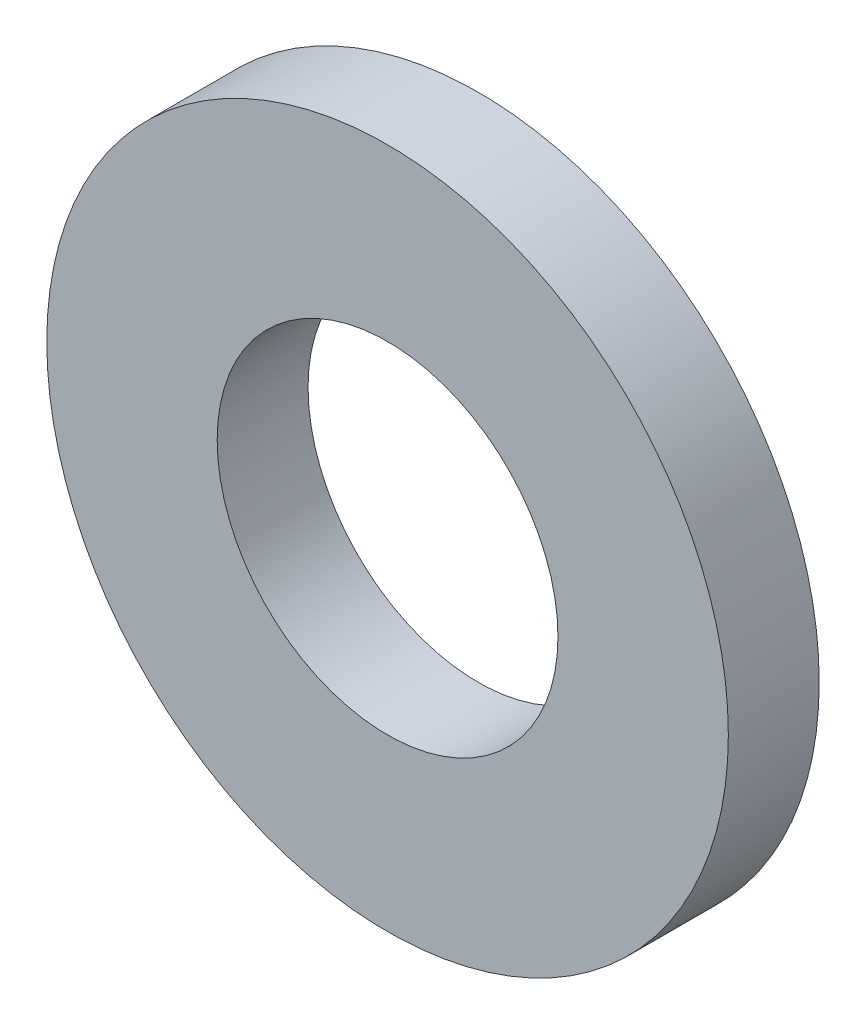
ISO-10303-21;
HEADER;
FILE_DESCRIPTION(('STEP AP214'),'2;1');
FILE_NAME('part.step','',(''),(''),'','','');
FILE_SCHEMA(('AUTOMOTIVE_DESIGN { 1 0 10303 214 1 1 1 1 }'));
ENDSEC;
DATA;
#1=APPLICATION_CONTEXT('core data for automotive mechanical design processes');
#2=APPLICATION_PROTOCOL_DEFINITION('international standard','automotive_design',2000,#1);
#3=PRODUCT_CONTEXT('',#1,'mechanical');
#4=PRODUCT('Part','Part','',(#3));
#5=PRODUCT_RELATED_PRODUCT_CATEGORY('part','',(#4));
#6=PRODUCT_DEFINITION_FORMATION('','',#4);
#7=PRODUCT_DEFINITION_CONTEXT('part definition',#1,'design');
#8=PRODUCT_DEFINITION('design','',#6,#7);
#9=PRODUCT_DEFINITION_SHAPE('','',#8);
#10=(LENGTH_UNIT() NAMED_UNIT(*) SI_UNIT(.MILLI.,.METRE.));
#11=(NAMED_UNIT(*) PLANE_ANGLE_UNIT() SI_UNIT($,.RADIAN.));
#12=(NAMED_UNIT(*) SI_UNIT($,.STERADIAN.) SOLID_ANGLE_UNIT());
#13=UNCERTAINTY_MEASURE_WITH_UNIT(LENGTH_MEASURE(1.E-05),#10,'distance_accuracy_value','');
#14=(GEOMETRIC_REPRESENTATION_CONTEXT(3) GLOBAL_UNCERTAINTY_ASSIGNED_CONTEXT((#13)) GLOBAL_UNIT_ASSIGNED_CONTEXT((#10,
#11,#12)) REPRESENTATION_CONTEXT('',''));
#15=CARTESIAN_POINT('',(0.,0.,0.));
#16=DIRECTION('',(0.,0.,1.));
#17=DIRECTION('',(1.,0.,0.));
#18=AXIS2_PLACEMENT_3D('',#15,#16,#17);
#19=CARTESIAN_POINT('',(0.,0.,0.799999999999991));
#20=DIRECTION('',(0.,0.,1.));
#21=DIRECTION('',(1.,0.,0.));
#22=AXIS2_PLACEMENT_3D('',#19,#20,#21);
#23=PLANE('',#22);
#24=CARTESIAN_POINT('',(0.,0.,0.799999999999991));
#25=DIRECTION('',(0.,0.,1.));
#26=DIRECTION('',(1.,0.,0.));
#27=AXIS2_PLACEMENT_3D('',#24,#25,#26);
#28=CIRCLE('',#27,3.);
#29=CARTESIAN_POINT('',(3.,0.,0.799999999999991));
#30=VERTEX_POINT('',#29);
#31=EDGE_CURVE('E10',#30,#30,#28,.T.);
#32=ORIENTED_EDGE('',*,*,#31,.T.);
#33=EDGE_LOOP('',(#32));
#34=FACE_BOUND('',#33,.T.);
#35=CARTESIAN_POINT('',(0.,0.,0.799999999999991));
#36=DIRECTION('',(0.,0.,1.));
#37=DIRECTION('',(1.,0.,0.));
#38=AXIS2_PLACEMENT_3D('',#35,#36,#37);
#39=CIRCLE('',#38,1.5);
#40=CARTESIAN_POINT('',(1.5,0.,0.799999999999991));
#41=VERTEX_POINT('',#40);
#42=EDGE_CURVE('E41',#41,#41,#39,.T.);
#43=ORIENTED_EDGE('',*,*,#42,.F.);
#44=EDGE_LOOP('',(#43));
#45=FACE_BOUND('',#44,.T.);
#46=ADVANCED_FACE('F30',(#34,#45),#23,.T.);
#47=CARTESIAN_POINT('',(0.,0.,0.));
#48=DIRECTION('',(0.,0.,1.));
#49=DIRECTION('',(1.,0.,0.));
#50=AXIS2_PLACEMENT_3D('',#47,#48,#49);
#51=PLANE('',#50);
#52=CARTESIAN_POINT('',(0.,0.,0.));
#53=DIRECTION('',(0.,0.,1.));
#54=DIRECTION('',(1.,0.,0.));
#55=AXIS2_PLACEMENT_3D('',#52,#53,#54);
#56=CIRCLE('',#55,3.);
#57=CARTESIAN_POINT('',(3.,0.,0.));
#58=VERTEX_POINT('',#57);
#59=EDGE_CURVE('E34',#58,#58,#56,.T.);
#60=ORIENTED_EDGE('',*,*,#59,.F.);
#61=EDGE_LOOP('',(#60));
#62=FACE_BOUND('',#61,.T.);
#63=CARTESIAN_POINT('',(0.,0.,0.));
#64=DIRECTION('',(0.,0.,1.));
#65=DIRECTION('',(1.,0.,0.));
#66=AXIS2_PLACEMENT_3D('',#63,#64,#65);
#67=CIRCLE('',#66,1.5);
#68=CARTESIAN_POINT('',(1.5,0.,0.));
#69=VERTEX_POINT('',#68);
#70=EDGE_CURVE('E43',#69,#69,#67,.T.);
#71=ORIENTED_EDGE('',*,*,#70,.T.);
#72=EDGE_LOOP('',(#71));
#73=FACE_BOUND('',#72,.T.);
#74=ADVANCED_FACE('F53',(#62,#73),#51,.F.);
#75=CARTESIAN_POINT('',(0.,0.,0.799999999999991));
#76=DIRECTION('',(0.,0.,-1.));
#77=DIRECTION('',(-1.,0.,0.));
#78=AXIS2_PLACEMENT_3D('',#75,#76,#77);
#79=CYLINDRICAL_SURFACE('',#78,3.);
#80=ORIENTED_EDGE('',*,*,#31,.F.);
#81=EDGE_LOOP('',(#80));
#82=FACE_BOUND('',#81,.T.);
#83=ORIENTED_EDGE('',*,*,#59,.T.);
#84=EDGE_LOOP('',(#83));
#85=FACE_BOUND('',#84,.T.);
#86=ADVANCED_FACE('F32',(#82,#85),#79,.T.);
#87=CARTESIAN_POINT('',(0.,0.,0.799999999999991));
#88=DIRECTION('',(0.,0.,-1.));
#89=DIRECTION('',(-1.,0.,0.));
#90=AXIS2_PLACEMENT_3D('',#87,#88,#89);
#91=CYLINDRICAL_SURFACE('',#90,1.5);
#92=ORIENTED_EDGE('',*,*,#42,.T.);
#93=EDGE_LOOP('',(#92));
#94=FACE_BOUND('',#93,.T.);
#95=ORIENTED_EDGE('',*,*,#70,.F.);
#96=EDGE_LOOP('',(#95));
#97=FACE_BOUND('',#96,.T.);
#98=ADVANCED_FACE('F49',(#94,#97),#91,.F.);
#99=CLOSED_SHELL('',(#46,#74,#86,#98));
#100=MANIFOLD_SOLID_BREP('B2',#99);
#101=ADVANCED_BREP_SHAPE_REPRESENTATION('',(#18,#100),#14);
#102=SHAPE_DEFINITION_REPRESENTATION(#9,#101);
ENDSEC;
END-ISO-10303-21;
